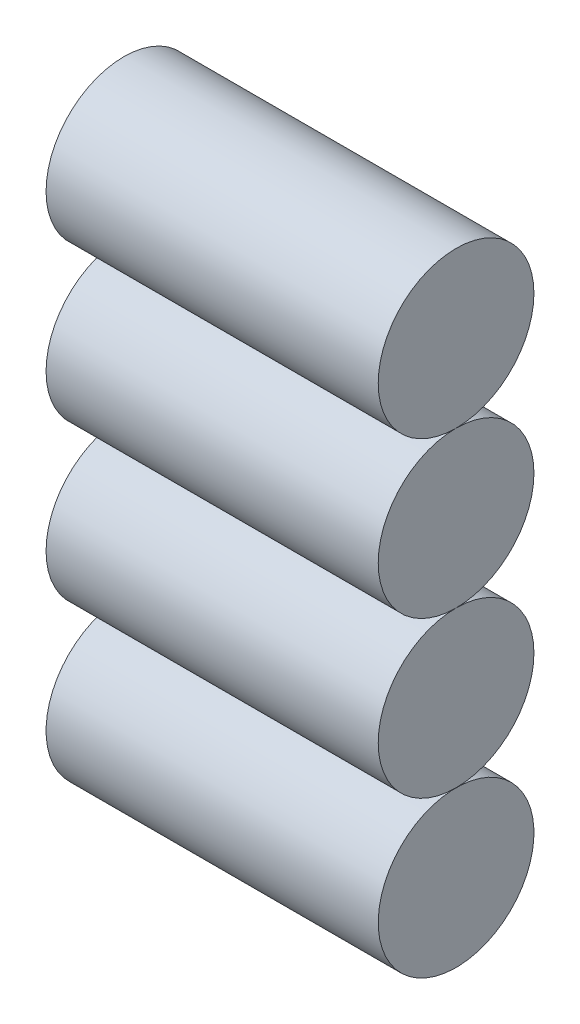
ISO-10303-21;
HEADER;
FILE_DESCRIPTION(('STEP AP214'),'2;1');
FILE_NAME('part.step','',(''),(''),'','','');
FILE_SCHEMA(('AUTOMOTIVE_DESIGN { 1 0 10303 214 1 1 1 1 }'));
ENDSEC;
DATA;
#1=APPLICATION_CONTEXT('core data for automotive mechanical design processes');
#2=APPLICATION_PROTOCOL_DEFINITION('international standard','automotive_design',2000,#1);
#3=PRODUCT_CONTEXT('',#1,'mechanical');
#4=PRODUCT('Part','Part','',(#3));
#5=PRODUCT_RELATED_PRODUCT_CATEGORY('part','',(#4));
#6=PRODUCT_DEFINITION_FORMATION('','',#4);
#7=PRODUCT_DEFINITION_CONTEXT('part definition',#1,'design');
#8=PRODUCT_DEFINITION('design','',#6,#7);
#9=PRODUCT_DEFINITION_SHAPE('','',#8);
#10=(LENGTH_UNIT() NAMED_UNIT(*) SI_UNIT(.MILLI.,.METRE.));
#11=(NAMED_UNIT(*) PLANE_ANGLE_UNIT() SI_UNIT($,.RADIAN.));
#12=(NAMED_UNIT(*) SI_UNIT($,.STERADIAN.) SOLID_ANGLE_UNIT());
#13=UNCERTAINTY_MEASURE_WITH_UNIT(LENGTH_MEASURE(1.E-05),#10,'distance_accuracy_value','');
#14=(GEOMETRIC_REPRESENTATION_CONTEXT(3) GLOBAL_UNCERTAINTY_ASSIGNED_CONTEXT((#13)) GLOBAL_UNIT_ASSIGNED_CONTEXT((#10,
#11,#12)) REPRESENTATION_CONTEXT('',''));
#15=CARTESIAN_POINT('',(0.,0.,0.));
#16=DIRECTION('',(0.,0.,1.));
#17=DIRECTION('',(1.,0.,0.));
#18=AXIS2_PLACEMENT_3D('',#15,#16,#17);
#19=CARTESIAN_POINT('',(-36.,135.,17.5));
#20=DIRECTION('',(1.,0.,0.));
#21=DIRECTION('',(0.,0.,-1.));
#22=AXIS2_PLACEMENT_3D('',#19,#20,#21);
#23=PLANE('',#22);
#24=CARTESIAN_POINT('',(-36.,50.6177976650265,-0.623559533005299));
#25=DIRECTION('',(-1.,0.,0.));
#26=DIRECTION('',(0.,0.,1.));
#27=AXIS2_PLACEMENT_3D('',#24,#25,#26);
#28=CIRCLE('',#27,16.8764404669947);
#29=CARTESIAN_POINT('',(-36.,50.6177976650265,16.2528809339894));
#30=VERTEX_POINT('',#29);
#31=EDGE_CURVE('E98',#30,#30,#28,.T.);
#32=ORIENTED_EDGE('',*,*,#31,.T.);
#33=EDGE_LOOP('',(#32));
#34=FACE_BOUND('',#33,.T.);
#35=ADVANCED_FACE('F94',(#34),#23,.F.);
#36=CARTESIAN_POINT('',(36.,135.,17.5));
#37=DIRECTION('',(-1.,0.,0.));
#38=DIRECTION('',(0.,0.,1.));
#39=AXIS2_PLACEMENT_3D('',#36,#37,#38);
#40=PLANE('',#39);
#41=CARTESIAN_POINT('',(36.,50.6177976650265,-0.623559533005299));
#42=DIRECTION('',(-1.,0.,0.));
#43=DIRECTION('',(0.,0.,1.));
#44=AXIS2_PLACEMENT_3D('',#41,#42,#43);
#45=CIRCLE('',#44,16.8764404669947);
#46=CARTESIAN_POINT('',(36.,50.6177976650265,16.2528809339894));
#47=VERTEX_POINT('',#46);
#48=EDGE_CURVE('E12',#47,#47,#45,.T.);
#49=ORIENTED_EDGE('',*,*,#48,.F.);
#50=EDGE_LOOP('',(#49));
#51=FACE_BOUND('',#50,.T.);
#52=ADVANCED_FACE('F96',(#51),#40,.F.);
#53=CARTESIAN_POINT('',(99.,50.6177976650265,-0.623559533005299));
#54=DIRECTION('',(-1.,0.,0.));
#55=DIRECTION('',(0.,0.,1.));
#56=AXIS2_PLACEMENT_3D('',#53,#54,#55);
#57=CYLINDRICAL_SURFACE('',#56,16.8764404669947);
#58=ORIENTED_EDGE('',*,*,#31,.F.);
#59=EDGE_LOOP('',(#58));
#60=FACE_BOUND('',#59,.T.);
#61=ORIENTED_EDGE('',*,*,#48,.T.);
#62=EDGE_LOOP('',(#61));
#63=FACE_BOUND('',#62,.T.);
#64=ADVANCED_FACE('F110',(#60,#63),#57,.T.);
#65=CLOSED_SHELL('',(#35,#52,#64));
#66=MANIFOLD_SOLID_BREP('B2',#65);
#67=CARTESIAN_POINT('',(36.,135.,17.5));
#68=DIRECTION('',(-1.,0.,0.));
#69=DIRECTION('',(0.,0.,1.));
#70=AXIS2_PLACEMENT_3D('',#67,#68,#69);
#71=PLANE('',#70);
#72=DIRECTION('',(0.,0.,-1.));
#73=VECTOR('',#72,1.);
#74=CARTESIAN_POINT('',(36.,0.,17.5));
#75=LINE('',#74,#73);
#76=CARTESIAN_POINT('',(36.,0.,-1.23490627446099E-13));
#77=VERTEX_POINT('',#76);
#78=CARTESIAN_POINT('',(36.,0.,-1.24711906601047));
#79=VERTEX_POINT('',#78);
#80=EDGE_CURVE('E189',#77,#79,#75,.T.);
#81=ORIENTED_EDGE('',*,*,#80,.T.);
#82=CARTESIAN_POINT('',(36.,16.8649167310371,-0.623559533005299));
#83=DIRECTION('',(-1.,0.,0.));
#84=DIRECTION('',(0.,0.,1.));
#85=AXIS2_PLACEMENT_3D('',#82,#83,#84);
#86=CIRCLE('',#85,16.8764404669947);
#87=EDGE_CURVE('E92',#77,#79,#86,.T.);
#88=ORIENTED_EDGE('',*,*,#87,.F.);
#89=EDGE_LOOP('',(#81,#88));
#90=FACE_BOUND('',#89,.T.);
#91=ADVANCED_FACE('F154',(#90),#71,.F.);
#92=CARTESIAN_POINT('',(-36.,135.,17.5));
#93=DIRECTION('',(1.,0.,0.));
#94=DIRECTION('',(0.,0.,-1.));
#95=AXIS2_PLACEMENT_3D('',#92,#93,#94);
#96=PLANE('',#95);
#97=CARTESIAN_POINT('',(-36.,16.8649167310371,-0.623559533005299));
#98=DIRECTION('',(-1.,0.,0.));
#99=DIRECTION('',(0.,0.,1.));
#100=AXIS2_PLACEMENT_3D('',#97,#98,#99);
#101=CIRCLE('',#100,16.8764404669947);
#102=CARTESIAN_POINT('',(-36.,0.,-1.23490627446099E-13));
#103=VERTEX_POINT('',#102);
#104=CARTESIAN_POINT('',(-36.,0.,-1.24711906601047));
#105=VERTEX_POINT('',#104);
#106=EDGE_CURVE('E157',#103,#105,#101,.T.);
#107=ORIENTED_EDGE('',*,*,#106,.T.);
#108=DIRECTION('',(0.,0.,1.));
#109=VECTOR('',#108,1.);
#110=CARTESIAN_POINT('',(-36.,0.,17.5));
#111=LINE('',#110,#109);
#112=EDGE_CURVE('E185',#105,#103,#111,.T.);
#113=ORIENTED_EDGE('',*,*,#112,.T.);
#114=EDGE_LOOP('',(#107,#113));
#115=FACE_BOUND('',#114,.T.);
#116=ADVANCED_FACE('F183',(#115),#96,.F.);
#117=CARTESIAN_POINT('',(0.,0.,0.));
#118=DIRECTION('',(0.,-1.,0.));
#119=DIRECTION('',(0.,0.,-1.));
#120=AXIS2_PLACEMENT_3D('',#117,#118,#119);
#121=PLANE('',#120);
#122=ORIENTED_EDGE('',*,*,#112,.F.);
#123=DIRECTION('',(-1.,0.,0.));
#124=VECTOR('',#123,1.);
#125=CARTESIAN_POINT('',(99.,0.,-1.24711906601047));
#126=LINE('',#125,#124);
#127=EDGE_CURVE('E191',#79,#105,#126,.T.);
#128=ORIENTED_EDGE('',*,*,#127,.F.);
#129=ORIENTED_EDGE('',*,*,#80,.F.);
#130=DIRECTION('',(-1.,0.,0.));
#131=VECTOR('',#130,1.);
#132=CARTESIAN_POINT('',(99.,0.,-1.23490627446099E-13));
#133=LINE('',#132,#131);
#134=EDGE_CURVE('E164',#77,#103,#133,.T.);
#135=ORIENTED_EDGE('',*,*,#134,.T.);
#136=EDGE_LOOP('',(#122,#128,#129,#135));
#137=FACE_BOUND('',#136,.T.);
#138=ADVANCED_FACE('F197',(#137),#121,.T.);
#139=CARTESIAN_POINT('',(99.,16.8649167310371,-0.623559533005299));
#140=DIRECTION('',(-1.,0.,0.));
#141=DIRECTION('',(0.,0.,1.));
#142=AXIS2_PLACEMENT_3D('',#139,#140,#141);
#143=CYLINDRICAL_SURFACE('',#142,16.8764404669947);
#144=ORIENTED_EDGE('',*,*,#87,.T.);
#145=ORIENTED_EDGE('',*,*,#127,.T.);
#146=ORIENTED_EDGE('',*,*,#106,.F.);
#147=ORIENTED_EDGE('',*,*,#134,.F.);
#148=EDGE_LOOP('',(#144,#145,#146,#147));
#149=FACE_BOUND('',#148,.T.);
#150=ADVANCED_FACE('F192',(#149),#143,.T.);
#151=CLOSED_SHELL('',(#91,#116,#138,#150));
#152=MANIFOLD_SOLID_BREP('B7',#151);
#153=CARTESIAN_POINT('',(99.,118.123559533005,-0.623559533005299));
#154=DIRECTION('',(-1.,0.,0.));
#155=DIRECTION('',(0.,0.,1.));
#156=AXIS2_PLACEMENT_3D('',#153,#154,#155);
#157=CYLINDRICAL_SURFACE('',#156,16.8764404669947);
#158=CARTESIAN_POINT('',(-36.,118.123559533005,-0.623559533005299));
#159=DIRECTION('',(-1.,0.,0.));
#160=DIRECTION('',(0.,0.,1.));
#161=AXIS2_PLACEMENT_3D('',#158,#159,#160);
#162=CIRCLE('',#161,16.8764404669947);
#163=CARTESIAN_POINT('',(-36.,118.123559533005,16.2528809339894));
#164=VERTEX_POINT('',#163);
#165=EDGE_CURVE('E153',#164,#164,#162,.T.);
#166=ORIENTED_EDGE('',*,*,#165,.F.);
#167=EDGE_LOOP('',(#166));
#168=FACE_BOUND('',#167,.T.);
#169=CARTESIAN_POINT('',(36.,118.123559533005,-0.623559533005299));
#170=DIRECTION('',(-1.,0.,0.));
#171=DIRECTION('',(0.,0.,1.));
#172=AXIS2_PLACEMENT_3D('',#169,#170,#171);
#173=CIRCLE('',#172,16.8764404669947);
#174=CARTESIAN_POINT('',(36.,118.123559533005,16.2528809339894));
#175=VERTEX_POINT('',#174);
#176=EDGE_CURVE('E259',#175,#175,#173,.T.);
#177=ORIENTED_EDGE('',*,*,#176,.T.);
#178=EDGE_LOOP('',(#177));
#179=FACE_BOUND('',#178,.T.);
#180=ADVANCED_FACE('F251',(#168,#179),#157,.T.);
#181=CARTESIAN_POINT('',(-36.,135.,17.5));
#182=DIRECTION('',(1.,0.,0.));
#183=DIRECTION('',(0.,0.,-1.));
#184=AXIS2_PLACEMENT_3D('',#181,#182,#183);
#185=PLANE('',#184);
#186=ORIENTED_EDGE('',*,*,#165,.T.);
#187=EDGE_LOOP('',(#186));
#188=FACE_BOUND('',#187,.T.);
#189=ADVANCED_FACE('F268',(#188),#185,.F.);
#190=CARTESIAN_POINT('',(36.,135.,17.5));
#191=DIRECTION('',(-1.,0.,0.));
#192=DIRECTION('',(0.,0.,1.));
#193=AXIS2_PLACEMENT_3D('',#190,#191,#192);
#194=PLANE('',#193);
#195=ORIENTED_EDGE('',*,*,#176,.F.);
#196=EDGE_LOOP('',(#195));
#197=FACE_BOUND('',#196,.T.);
#198=ADVANCED_FACE('F253',(#197),#194,.F.);
#199=CLOSED_SHELL('',(#180,#189,#198));
#200=MANIFOLD_SOLID_BREP('B86',#199);
#201=CARTESIAN_POINT('',(-36.,135.,17.5));
#202=DIRECTION('',(1.,0.,0.));
#203=DIRECTION('',(0.,0.,-1.));
#204=AXIS2_PLACEMENT_3D('',#201,#202,#203);
#205=PLANE('',#204);
#206=CARTESIAN_POINT('',(-36.,84.3706785990159,-0.623559533005299));
#207=DIRECTION('',(-1.,0.,0.));
#208=DIRECTION('',(0.,0.,1.));
#209=AXIS2_PLACEMENT_3D('',#206,#207,#208);
#210=CIRCLE('',#209,16.8764404669947);
#211=CARTESIAN_POINT('',(-36.,84.3706785990159,16.2528809339894));
#212=VERTEX_POINT('',#211);
#213=EDGE_CURVE('E311',#212,#212,#210,.T.);
#214=ORIENTED_EDGE('',*,*,#213,.T.);
#215=EDGE_LOOP('',(#214));
#216=FACE_BOUND('',#215,.T.);
#217=ADVANCED_FACE('F303',(#216),#205,.F.);
#218=CARTESIAN_POINT('',(36.,135.,17.5));
#219=DIRECTION('',(-1.,0.,0.));
#220=DIRECTION('',(0.,0.,1.));
#221=AXIS2_PLACEMENT_3D('',#218,#219,#220);
#222=PLANE('',#221);
#223=CARTESIAN_POINT('',(36.,84.3706785990159,-0.623559533005299));
#224=DIRECTION('',(-1.,0.,0.));
#225=DIRECTION('',(0.,0.,1.));
#226=AXIS2_PLACEMENT_3D('',#223,#224,#225);
#227=CIRCLE('',#226,16.8764404669947);
#228=CARTESIAN_POINT('',(36.,84.3706785990159,16.2528809339894));
#229=VERTEX_POINT('',#228);
#230=EDGE_CURVE('E250',#229,#229,#227,.T.);
#231=ORIENTED_EDGE('',*,*,#230,.F.);
#232=EDGE_LOOP('',(#231));
#233=FACE_BOUND('',#232,.T.);
#234=ADVANCED_FACE('F305',(#233),#222,.F.);
#235=CARTESIAN_POINT('',(99.,84.3706785990159,-0.623559533005299));
#236=DIRECTION('',(-1.,0.,0.));
#237=DIRECTION('',(0.,0.,1.));
#238=AXIS2_PLACEMENT_3D('',#235,#236,#237);
#239=CYLINDRICAL_SURFACE('',#238,16.8764404669947);
#240=ORIENTED_EDGE('',*,*,#213,.F.);
#241=EDGE_LOOP('',(#240));
#242=FACE_BOUND('',#241,.T.);
#243=ORIENTED_EDGE('',*,*,#230,.T.);
#244=EDGE_LOOP('',(#243));
#245=FACE_BOUND('',#244,.T.);
#246=ADVANCED_FACE('F319',(#242,#245),#239,.T.);
#247=CLOSED_SHELL('',(#217,#234,#246));
#248=MANIFOLD_SOLID_BREP('B148',#247);
#249=ADVANCED_BREP_SHAPE_REPRESENTATION('',(#18,#66,#152,#200,#248),#14);
#250=SHAPE_DEFINITION_REPRESENTATION(#9,#249);
ENDSEC;
END-ISO-10303-21;
